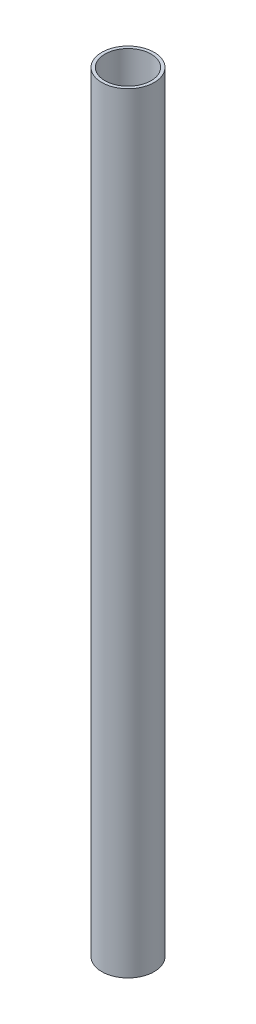
ISO-10303-21;
HEADER;
FILE_DESCRIPTION(('STEP AP214'),'2;1');
FILE_NAME('part.step','',(''),(''),'','','');
FILE_SCHEMA(('AUTOMOTIVE_DESIGN { 1 0 10303 214 1 1 1 1 }'));
ENDSEC;
DATA;
#1=APPLICATION_CONTEXT('core data for automotive mechanical design processes');
#2=APPLICATION_PROTOCOL_DEFINITION('international standard','automotive_design',2000,#1);
#3=PRODUCT_CONTEXT('',#1,'mechanical');
#4=PRODUCT('Part','Part','',(#3));
#5=PRODUCT_RELATED_PRODUCT_CATEGORY('part','',(#4));
#6=PRODUCT_DEFINITION_FORMATION('','',#4);
#7=PRODUCT_DEFINITION_CONTEXT('part definition',#1,'design');
#8=PRODUCT_DEFINITION('design','',#6,#7);
#9=PRODUCT_DEFINITION_SHAPE('','',#8);
#10=(LENGTH_UNIT() NAMED_UNIT(*) SI_UNIT(.MILLI.,.METRE.));
#11=(NAMED_UNIT(*) PLANE_ANGLE_UNIT() SI_UNIT($,.RADIAN.));
#12=(NAMED_UNIT(*) SI_UNIT($,.STERADIAN.) SOLID_ANGLE_UNIT());
#13=UNCERTAINTY_MEASURE_WITH_UNIT(LENGTH_MEASURE(1.E-05),#10,'distance_accuracy_value','');
#14=(GEOMETRIC_REPRESENTATION_CONTEXT(3) GLOBAL_UNCERTAINTY_ASSIGNED_CONTEXT((#13)) GLOBAL_UNIT_ASSIGNED_CONTEXT((#10,
#11,#12)) REPRESENTATION_CONTEXT('',''));
#15=CARTESIAN_POINT('',(0.,0.,0.));
#16=DIRECTION('',(0.,0.,1.));
#17=DIRECTION('',(1.,0.,0.));
#18=AXIS2_PLACEMENT_3D('',#15,#16,#17);
#19=CARTESIAN_POINT('',(0.,500.,0.));
#20=DIRECTION('',(0.,1.,0.));
#21=DIRECTION('',(0.,0.,1.));
#22=AXIS2_PLACEMENT_3D('',#19,#20,#21);
#23=PLANE('',#22);
#24=CARTESIAN_POINT('',(0.,500.,0.));
#25=DIRECTION('',(0.,1.,0.));
#26=DIRECTION('',(0.,0.,1.));
#27=AXIS2_PLACEMENT_3D('',#24,#25,#26);
#28=CIRCLE('',#27,17.);
#29=CARTESIAN_POINT('',(0.,500.,17.));
#30=VERTEX_POINT('',#29);
#31=EDGE_CURVE('E10',#30,#30,#28,.T.);
#32=ORIENTED_EDGE('',*,*,#31,.T.);
#33=EDGE_LOOP('',(#32));
#34=FACE_BOUND('',#33,.T.);
#35=CARTESIAN_POINT('',(0.,500.,0.));
#36=DIRECTION('',(0.,1.,0.));
#37=DIRECTION('',(0.,0.,1.));
#38=AXIS2_PLACEMENT_3D('',#35,#36,#37);
#39=CIRCLE('',#38,15.);
#40=CARTESIAN_POINT('',(0.,500.,15.));
#41=VERTEX_POINT('',#40);
#42=EDGE_CURVE('E50',#41,#41,#39,.T.);
#43=ORIENTED_EDGE('',*,*,#42,.F.);
#44=EDGE_LOOP('',(#43));
#45=FACE_BOUND('',#44,.T.);
#46=ADVANCED_FACE('F37',(#34,#45),#23,.T.);
#47=CARTESIAN_POINT('',(0.,0.,0.));
#48=DIRECTION('',(0.,1.,0.));
#49=DIRECTION('',(0.,0.,1.));
#50=AXIS2_PLACEMENT_3D('',#47,#48,#49);
#51=PLANE('',#50);
#52=CARTESIAN_POINT('',(0.,0.,0.));
#53=DIRECTION('',(0.,1.,0.));
#54=DIRECTION('',(0.,0.,1.));
#55=AXIS2_PLACEMENT_3D('',#52,#53,#54);
#56=CIRCLE('',#55,17.);
#57=CARTESIAN_POINT('',(0.,0.,17.));
#58=VERTEX_POINT('',#57);
#59=EDGE_CURVE('E41',#58,#58,#56,.T.);
#60=ORIENTED_EDGE('',*,*,#59,.F.);
#61=EDGE_LOOP('',(#60));
#62=FACE_BOUND('',#61,.T.);
#63=CARTESIAN_POINT('',(0.,0.,0.));
#64=DIRECTION('',(0.,1.,0.));
#65=DIRECTION('',(0.,0.,1.));
#66=AXIS2_PLACEMENT_3D('',#63,#64,#65);
#67=CIRCLE('',#66,15.);
#68=CARTESIAN_POINT('',(0.,0.,15.));
#69=VERTEX_POINT('',#68);
#70=EDGE_CURVE('E52',#69,#69,#67,.T.);
#71=ORIENTED_EDGE('',*,*,#70,.T.);
#72=EDGE_LOOP('',(#71));
#73=FACE_BOUND('',#72,.T.);
#74=ADVANCED_FACE('F64',(#62,#73),#51,.F.);
#75=CARTESIAN_POINT('',(0.,500.,0.));
#76=DIRECTION('',(0.,-1.,0.));
#77=DIRECTION('',(0.,0.,-1.));
#78=AXIS2_PLACEMENT_3D('',#75,#76,#77);
#79=CYLINDRICAL_SURFACE('',#78,17.);
#80=ORIENTED_EDGE('',*,*,#31,.F.);
#81=EDGE_LOOP('',(#80));
#82=FACE_BOUND('',#81,.T.);
#83=ORIENTED_EDGE('',*,*,#59,.T.);
#84=EDGE_LOOP('',(#83));
#85=FACE_BOUND('',#84,.T.);
#86=ADVANCED_FACE('F39',(#82,#85),#79,.T.);
#87=CARTESIAN_POINT('',(0.,500.,0.));
#88=DIRECTION('',(0.,-1.,0.));
#89=DIRECTION('',(0.,0.,-1.));
#90=AXIS2_PLACEMENT_3D('',#87,#88,#89);
#91=CYLINDRICAL_SURFACE('',#90,15.);
#92=ORIENTED_EDGE('',*,*,#42,.T.);
#93=EDGE_LOOP('',(#92));
#94=FACE_BOUND('',#93,.T.);
#95=ORIENTED_EDGE('',*,*,#70,.F.);
#96=EDGE_LOOP('',(#95));
#97=FACE_BOUND('',#96,.T.);
#98=ADVANCED_FACE('F60',(#94,#97),#91,.F.);
#99=CLOSED_SHELL('',(#46,#74,#86,#98));
#100=MANIFOLD_SOLID_BREP('B2',#99);
#101=ADVANCED_BREP_SHAPE_REPRESENTATION('',(#18,#100),#14);
#102=SHAPE_DEFINITION_REPRESENTATION(#9,#101);
ENDSEC;
END-ISO-10303-21;
